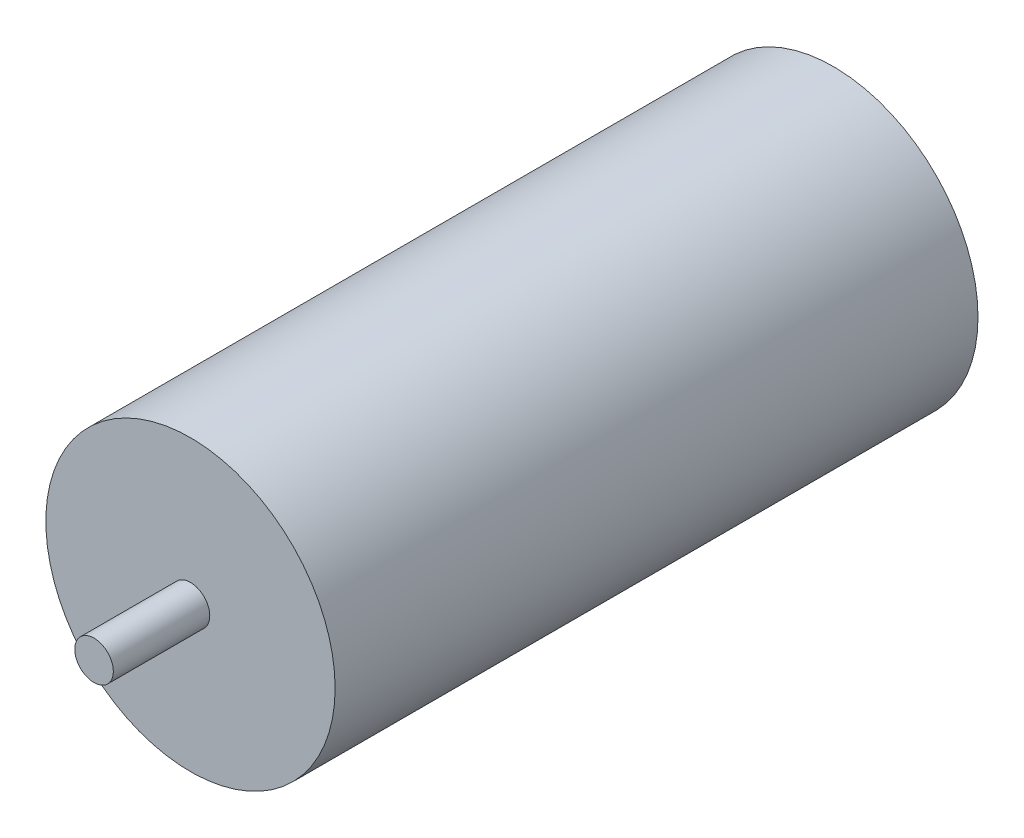
ISO-10303-21;
HEADER;
FILE_DESCRIPTION(('STEP AP214'),'2;1');
FILE_NAME('part.step','',(''),(''),'','','');
FILE_SCHEMA(('AUTOMOTIVE_DESIGN { 1 0 10303 214 1 1 1 1 }'));
ENDSEC;
DATA;
#1=APPLICATION_CONTEXT('core data for automotive mechanical design processes');
#2=APPLICATION_PROTOCOL_DEFINITION('international standard','automotive_design',2000,#1);
#3=PRODUCT_CONTEXT('',#1,'mechanical');
#4=PRODUCT('Part','Part','',(#3));
#5=PRODUCT_RELATED_PRODUCT_CATEGORY('part','',(#4));
#6=PRODUCT_DEFINITION_FORMATION('','',#4);
#7=PRODUCT_DEFINITION_CONTEXT('part definition',#1,'design');
#8=PRODUCT_DEFINITION('design','',#6,#7);
#9=PRODUCT_DEFINITION_SHAPE('','',#8);
#10=(LENGTH_UNIT() NAMED_UNIT(*) SI_UNIT(.MILLI.,.METRE.));
#11=(NAMED_UNIT(*) PLANE_ANGLE_UNIT() SI_UNIT($,.RADIAN.));
#12=(NAMED_UNIT(*) SI_UNIT($,.STERADIAN.) SOLID_ANGLE_UNIT());
#13=UNCERTAINTY_MEASURE_WITH_UNIT(LENGTH_MEASURE(1.E-05),#10,'distance_accuracy_value','');
#14=(GEOMETRIC_REPRESENTATION_CONTEXT(3) GLOBAL_UNCERTAINTY_ASSIGNED_CONTEXT((#13)) GLOBAL_UNIT_ASSIGNED_CONTEXT((#10,
#11,#12)) REPRESENTATION_CONTEXT('',''));
#15=CARTESIAN_POINT('',(0.,0.,0.));
#16=DIRECTION('',(0.,0.,1.));
#17=DIRECTION('',(1.,0.,0.));
#18=AXIS2_PLACEMENT_3D('',#15,#16,#17);
#19=CARTESIAN_POINT('',(0.,0.,100.));
#20=DIRECTION('',(0.,0.,-1.));
#21=DIRECTION('',(-1.,0.,0.));
#22=AXIS2_PLACEMENT_3D('',#19,#20,#21);
#23=CYLINDRICAL_SURFACE('',#22,22.5);
#24=CARTESIAN_POINT('',(0.,0.,100.));
#25=DIRECTION('',(0.,0.,1.));
#26=DIRECTION('',(1.,0.,0.));
#27=AXIS2_PLACEMENT_3D('',#24,#25,#26);
#28=CIRCLE('',#27,22.5);
#29=CARTESIAN_POINT('',(22.5,0.,100.));
#30=VERTEX_POINT('',#29);
#31=EDGE_CURVE('E10',#30,#30,#28,.T.);
#32=ORIENTED_EDGE('',*,*,#31,.F.);
#33=EDGE_LOOP('',(#32));
#34=FACE_BOUND('',#33,.T.);
#35=CARTESIAN_POINT('',(0.,0.,0.));
#36=DIRECTION('',(0.,0.,1.));
#37=DIRECTION('',(1.,0.,0.));
#38=AXIS2_PLACEMENT_3D('',#35,#36,#37);
#39=CIRCLE('',#38,22.5);
#40=CARTESIAN_POINT('',(22.5,0.,0.));
#41=VERTEX_POINT('',#40);
#42=EDGE_CURVE('E34',#41,#41,#39,.T.);
#43=ORIENTED_EDGE('',*,*,#42,.T.);
#44=EDGE_LOOP('',(#43));
#45=FACE_BOUND('',#44,.T.);
#46=ADVANCED_FACE('F31',(#34,#45),#23,.T.);
#47=CARTESIAN_POINT('',(0.,0.,100.));
#48=DIRECTION('',(0.,0.,1.));
#49=DIRECTION('',(1.,0.,0.));
#50=AXIS2_PLACEMENT_3D('',#47,#48,#49);
#51=PLANE('',#50);
#52=CARTESIAN_POINT('',(0.,0.,100.));
#53=DIRECTION('',(0.,0.,1.));
#54=DIRECTION('',(1.,0.,0.));
#55=AXIS2_PLACEMENT_3D('',#52,#53,#54);
#56=CIRCLE('',#55,3.);
#57=CARTESIAN_POINT('',(3.,0.,100.));
#58=VERTEX_POINT('',#57);
#59=EDGE_CURVE('E43',#58,#58,#56,.T.);
#60=ORIENTED_EDGE('',*,*,#59,.F.);
#61=EDGE_LOOP('',(#60));
#62=FACE_BOUND('',#61,.T.);
#63=ORIENTED_EDGE('',*,*,#31,.T.);
#64=EDGE_LOOP('',(#63));
#65=FACE_BOUND('',#64,.T.);
#66=ADVANCED_FACE('F58',(#62,#65),#51,.T.);
#67=CARTESIAN_POINT('',(0.,0.,0.));
#68=DIRECTION('',(0.,0.,1.));
#69=DIRECTION('',(1.,0.,0.));
#70=AXIS2_PLACEMENT_3D('',#67,#68,#69);
#71=PLANE('',#70);
#72=ORIENTED_EDGE('',*,*,#42,.F.);
#73=EDGE_LOOP('',(#72));
#74=FACE_BOUND('',#73,.T.);
#75=ADVANCED_FACE('F54',(#74),#71,.F.);
#76=CARTESIAN_POINT('',(0.,0.,115.));
#77=DIRECTION('',(0.,0.,-1.));
#78=DIRECTION('',(-1.,0.,0.));
#79=AXIS2_PLACEMENT_3D('',#76,#77,#78);
#80=CYLINDRICAL_SURFACE('',#79,3.);
#81=CARTESIAN_POINT('',(0.,0.,115.));
#82=DIRECTION('',(0.,0.,1.));
#83=DIRECTION('',(1.,0.,0.));
#84=AXIS2_PLACEMENT_3D('',#81,#82,#83);
#85=CIRCLE('',#84,3.);
#86=CARTESIAN_POINT('',(3.,0.,115.));
#87=VERTEX_POINT('',#86);
#88=EDGE_CURVE('E41',#87,#87,#85,.T.);
#89=ORIENTED_EDGE('',*,*,#88,.F.);
#90=EDGE_LOOP('',(#89));
#91=FACE_BOUND('',#90,.T.);
#92=ORIENTED_EDGE('',*,*,#59,.T.);
#93=EDGE_LOOP('',(#92));
#94=FACE_BOUND('',#93,.T.);
#95=ADVANCED_FACE('F51',(#91,#94),#80,.T.);
#96=CARTESIAN_POINT('',(0.,0.,115.));
#97=DIRECTION('',(0.,0.,1.));
#98=DIRECTION('',(1.,0.,0.));
#99=AXIS2_PLACEMENT_3D('',#96,#97,#98);
#100=PLANE('',#99);
#101=ORIENTED_EDGE('',*,*,#88,.T.);
#102=EDGE_LOOP('',(#101));
#103=FACE_BOUND('',#102,.T.);
#104=ADVANCED_FACE('F49',(#103),#100,.T.);
#105=CLOSED_SHELL('',(#46,#66,#75,#95,#104));
#106=MANIFOLD_SOLID_BREP('B2',#105);
#107=ADVANCED_BREP_SHAPE_REPRESENTATION('',(#18,#106),#14);
#108=SHAPE_DEFINITION_REPRESENTATION(#9,#107);
ENDSEC;
END-ISO-10303-21;
